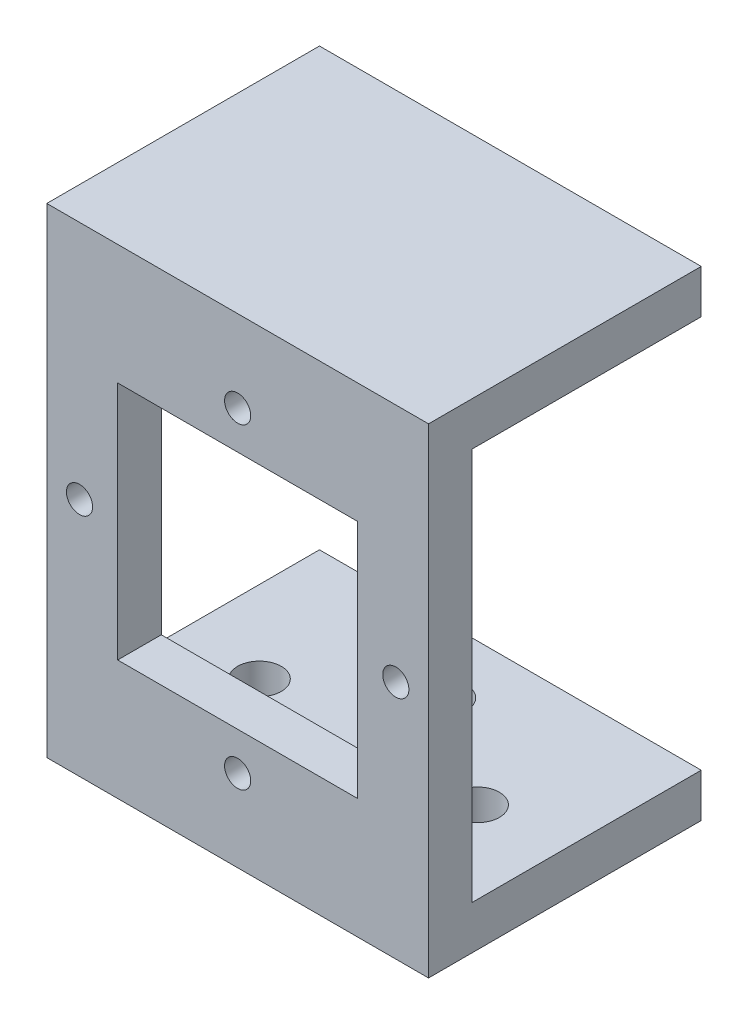
ISO-10303-21;
HEADER;
FILE_DESCRIPTION(('STEP AP214'),'2;1');
FILE_NAME('part.step','',(''),(''),'','','');
FILE_SCHEMA(('AUTOMOTIVE_DESIGN { 1 0 10303 214 1 1 1 1 }'));
ENDSEC;
DATA;
#1=APPLICATION_CONTEXT('core data for automotive mechanical design processes');
#2=APPLICATION_PROTOCOL_DEFINITION('international standard','automotive_design',2000,#1);
#3=PRODUCT_CONTEXT('',#1,'mechanical');
#4=PRODUCT('Part','Part','',(#3));
#5=PRODUCT_RELATED_PRODUCT_CATEGORY('part','',(#4));
#6=PRODUCT_DEFINITION_FORMATION('','',#4);
#7=PRODUCT_DEFINITION_CONTEXT('part definition',#1,'design');
#8=PRODUCT_DEFINITION('design','',#6,#7);
#9=PRODUCT_DEFINITION_SHAPE('','',#8);
#10=(LENGTH_UNIT() NAMED_UNIT(*) SI_UNIT(.MILLI.,.METRE.));
#11=(NAMED_UNIT(*) PLANE_ANGLE_UNIT() SI_UNIT($,.RADIAN.));
#12=(NAMED_UNIT(*) SI_UNIT($,.STERADIAN.) SOLID_ANGLE_UNIT());
#13=UNCERTAINTY_MEASURE_WITH_UNIT(LENGTH_MEASURE(1.E-05),#10,'distance_accuracy_value','');
#14=(GEOMETRIC_REPRESENTATION_CONTEXT(3) GLOBAL_UNCERTAINTY_ASSIGNED_CONTEXT((#13)) GLOBAL_UNIT_ASSIGNED_CONTEXT((#10,
#11,#12)) REPRESENTATION_CONTEXT('',''));
#15=CARTESIAN_POINT('',(0.,0.,0.));
#16=DIRECTION('',(0.,0.,1.));
#17=DIRECTION('',(1.,0.,0.));
#18=AXIS2_PLACEMENT_3D('',#15,#16,#17);
#19=CARTESIAN_POINT('',(0.,0.,4.));
#20=DIRECTION('',(0.,0.,-1.));
#21=DIRECTION('',(-1.,0.,0.));
#22=AXIS2_PLACEMENT_3D('',#19,#20,#21);
#23=PLANE('',#22);
#24=DIRECTION('',(0.,1.,0.));
#25=VECTOR('',#24,1.);
#26=CARTESIAN_POINT('',(17.5,18.,4.));
#27=LINE('',#26,#25);
#28=CARTESIAN_POINT('',(17.5,-22.,4.));
#29=VERTEX_POINT('',#28);
#30=CARTESIAN_POINT('',(17.5,22.,4.));
#31=VERTEX_POINT('',#30);
#32=EDGE_CURVE('E42',#29,#31,#27,.T.);
#33=ORIENTED_EDGE('',*,*,#32,.T.);
#34=DIRECTION('',(1.,0.,0.));
#35=VECTOR('',#34,1.);
#36=CARTESIAN_POINT('',(-17.5,22.,4.));
#37=LINE('',#36,#35);
#38=CARTESIAN_POINT('',(-17.5,22.,4.));
#39=VERTEX_POINT('',#38);
#40=EDGE_CURVE('E135',#39,#31,#37,.T.);
#41=ORIENTED_EDGE('',*,*,#40,.F.);
#42=DIRECTION('',(0.,-1.,0.));
#43=VECTOR('',#42,1.);
#44=CARTESIAN_POINT('',(-17.5,0.,4.));
#45=LINE('',#44,#43);
#46=CARTESIAN_POINT('',(-17.5,-22.,4.));
#47=VERTEX_POINT('',#46);
#48=EDGE_CURVE('E11',#39,#47,#45,.T.);
#49=ORIENTED_EDGE('',*,*,#48,.T.);
#50=DIRECTION('',(-1.,0.,0.));
#51=VECTOR('',#50,1.);
#52=CARTESIAN_POINT('',(17.5,-22.,4.));
#53=LINE('',#52,#51);
#54=EDGE_CURVE('E186',#29,#47,#53,.T.);
#55=ORIENTED_EDGE('',*,*,#54,.F.);
#56=EDGE_LOOP('',(#33,#41,#49,#55));
#57=FACE_BOUND('',#56,.T.);
#58=DIRECTION('',(0.,-1.,0.));
#59=VECTOR('',#58,1.);
#60=CARTESIAN_POINT('',(-11.,-11.,4.));
#61=LINE('',#60,#59);
#62=CARTESIAN_POINT('',(-11.,11.,4.));
#63=VERTEX_POINT('',#62);
#64=CARTESIAN_POINT('',(-11.,-11.,4.));
#65=VERTEX_POINT('',#64);
#66=EDGE_CURVE('E229',#63,#65,#61,.T.);
#67=ORIENTED_EDGE('',*,*,#66,.F.);
#68=DIRECTION('',(-1.,0.,0.));
#69=VECTOR('',#68,1.);
#70=CARTESIAN_POINT('',(11.,11.,4.));
#71=LINE('',#70,#69);
#72=CARTESIAN_POINT('',(11.,11.,4.));
#73=VERTEX_POINT('',#72);
#74=EDGE_CURVE('E236',#73,#63,#71,.T.);
#75=ORIENTED_EDGE('',*,*,#74,.F.);
#76=DIRECTION('',(0.,1.,0.));
#77=VECTOR('',#76,1.);
#78=CARTESIAN_POINT('',(11.,-11.,4.));
#79=LINE('',#78,#77);
#80=CARTESIAN_POINT('',(11.,-11.,4.));
#81=VERTEX_POINT('',#80);
#82=EDGE_CURVE('E234',#81,#73,#79,.T.);
#83=ORIENTED_EDGE('',*,*,#82,.F.);
#84=DIRECTION('',(1.,0.,0.));
#85=VECTOR('',#84,1.);
#86=CARTESIAN_POINT('',(11.,-11.,4.));
#87=LINE('',#86,#85);
#88=EDGE_CURVE('E231',#65,#81,#87,.T.);
#89=ORIENTED_EDGE('',*,*,#88,.F.);
#90=EDGE_LOOP('',(#67,#75,#83,#89));
#91=FACE_BOUND('',#90,.T.);
#92=CARTESIAN_POINT('',(0.,14.5,4.));
#93=DIRECTION('',(0.,0.,1.));
#94=DIRECTION('',(1.,0.,0.));
#95=AXIS2_PLACEMENT_3D('',#92,#93,#94);
#96=CIRCLE('',#95,1.2);
#97=CARTESIAN_POINT('',(1.19999999999999,14.5,4.));
#98=VERTEX_POINT('',#97);
#99=EDGE_CURVE('E224',#98,#98,#96,.T.);
#100=ORIENTED_EDGE('',*,*,#99,.F.);
#101=EDGE_LOOP('',(#100));
#102=FACE_BOUND('',#101,.T.);
#103=CARTESIAN_POINT('',(14.5000000000004,4.07452098546407E-13,4.));
#104=DIRECTION('',(0.,0.,1.));
#105=DIRECTION('',(1.,0.,0.));
#106=AXIS2_PLACEMENT_3D('',#103,#104,#105);
#107=CIRCLE('',#106,1.2);
#108=CARTESIAN_POINT('',(15.7000000000004,4.07452098546407E-13,4.));
#109=VERTEX_POINT('',#108);
#110=EDGE_CURVE('E218',#109,#109,#107,.T.);
#111=ORIENTED_EDGE('',*,*,#110,.F.);
#112=EDGE_LOOP('',(#111));
#113=FACE_BOUND('',#112,.T.);
#114=CARTESIAN_POINT('',(8.12078888257941E-13,-14.5,4.));
#115=DIRECTION('',(0.,0.,1.));
#116=DIRECTION('',(1.,0.,0.));
#117=AXIS2_PLACEMENT_3D('',#114,#115,#116);
#118=CIRCLE('',#117,1.2);
#119=CARTESIAN_POINT('',(1.20000000000081,-14.5,4.));
#120=VERTEX_POINT('',#119);
#121=EDGE_CURVE('E212',#120,#120,#118,.T.);
#122=ORIENTED_EDGE('',*,*,#121,.F.);
#123=EDGE_LOOP('',(#122));
#124=FACE_BOUND('',#123,.T.);
#125=CARTESIAN_POINT('',(-14.4999999999996,-4.0922783640517E-13,4.));
#126=DIRECTION('',(0.,0.,1.));
#127=DIRECTION('',(1.,0.,0.));
#128=AXIS2_PLACEMENT_3D('',#125,#126,#127);
#129=CIRCLE('',#128,1.2);
#130=CARTESIAN_POINT('',(-13.2999999999996,-4.0922783640517E-13,4.));
#131=VERTEX_POINT('',#130);
#132=EDGE_CURVE('E205',#131,#131,#129,.T.);
#133=ORIENTED_EDGE('',*,*,#132,.F.);
#134=EDGE_LOOP('',(#133));
#135=FACE_BOUND('',#134,.T.);
#136=ADVANCED_FACE('F32',(#57,#91,#102,#113,#124,#135),#23,.F.);
#137=CARTESIAN_POINT('',(0.,0.,0.));
#138=DIRECTION('',(0.,0.,-1.));
#139=DIRECTION('',(-1.,0.,0.));
#140=AXIS2_PLACEMENT_3D('',#137,#138,#139);
#141=PLANE('',#140);
#142=CARTESIAN_POINT('',(8.12078888257941E-13,-14.5,0.));
#143=DIRECTION('',(0.,0.,1.));
#144=DIRECTION('',(1.,0.,0.));
#145=AXIS2_PLACEMENT_3D('',#142,#143,#144);
#146=CIRCLE('',#145,1.2);
#147=CARTESIAN_POINT('',(1.20000000000081,-14.5,0.));
#148=VERTEX_POINT('',#147);
#149=EDGE_CURVE('E208',#148,#148,#146,.T.);
#150=ORIENTED_EDGE('',*,*,#149,.T.);
#151=EDGE_LOOP('',(#150));
#152=FACE_BOUND('',#151,.T.);
#153=CARTESIAN_POINT('',(0.,14.5,0.));
#154=DIRECTION('',(0.,0.,1.));
#155=DIRECTION('',(1.,0.,0.));
#156=AXIS2_PLACEMENT_3D('',#153,#154,#155);
#157=CIRCLE('',#156,1.2);
#158=CARTESIAN_POINT('',(1.19999999999999,14.5,0.));
#159=VERTEX_POINT('',#158);
#160=EDGE_CURVE('E221',#159,#159,#157,.T.);
#161=ORIENTED_EDGE('',*,*,#160,.T.);
#162=EDGE_LOOP('',(#161));
#163=FACE_BOUND('',#162,.T.);
#164=DIRECTION('',(-1.,0.,0.));
#165=VECTOR('',#164,1.);
#166=CARTESIAN_POINT('',(-17.5,18.,0.));
#167=LINE('',#166,#165);
#168=CARTESIAN_POINT('',(17.5,18.,0.));
#169=VERTEX_POINT('',#168);
#170=CARTESIAN_POINT('',(-17.5,18.,0.));
#171=VERTEX_POINT('',#170);
#172=EDGE_CURVE('E36',#169,#171,#167,.T.);
#173=ORIENTED_EDGE('',*,*,#172,.F.);
#174=DIRECTION('',(0.,1.,0.));
#175=VECTOR('',#174,1.);
#176=CARTESIAN_POINT('',(17.5,0.,0.));
#177=LINE('',#176,#175);
#178=CARTESIAN_POINT('',(17.5,-18.,0.));
#179=VERTEX_POINT('',#178);
#180=EDGE_CURVE('E254',#179,#169,#177,.T.);
#181=ORIENTED_EDGE('',*,*,#180,.F.);
#182=DIRECTION('',(1.,0.,0.));
#183=VECTOR('',#182,1.);
#184=CARTESIAN_POINT('',(17.5,-18.,0.));
#185=LINE('',#184,#183);
#186=CARTESIAN_POINT('',(-17.5,-18.,0.));
#187=VERTEX_POINT('',#186);
#188=EDGE_CURVE('E261',#187,#179,#185,.T.);
#189=ORIENTED_EDGE('',*,*,#188,.F.);
#190=DIRECTION('',(0.,-1.,0.));
#191=VECTOR('',#190,1.);
#192=CARTESIAN_POINT('',(-17.5,0.,0.));
#193=LINE('',#192,#191);
#194=EDGE_CURVE('E264',#171,#187,#193,.T.);
#195=ORIENTED_EDGE('',*,*,#194,.F.);
#196=EDGE_LOOP('',(#173,#181,#189,#195));
#197=FACE_BOUND('',#196,.T.);
#198=DIRECTION('',(-1.,0.,0.));
#199=VECTOR('',#198,1.);
#200=CARTESIAN_POINT('',(11.,11.,0.));
#201=LINE('',#200,#199);
#202=CARTESIAN_POINT('',(11.,11.,0.));
#203=VERTEX_POINT('',#202);
#204=CARTESIAN_POINT('',(-11.,11.,0.));
#205=VERTEX_POINT('',#204);
#206=EDGE_CURVE('E232',#203,#205,#201,.T.);
#207=ORIENTED_EDGE('',*,*,#206,.T.);
#208=DIRECTION('',(0.,-1.,0.));
#209=VECTOR('',#208,1.);
#210=CARTESIAN_POINT('',(-11.,-11.,0.));
#211=LINE('',#210,#209);
#212=CARTESIAN_POINT('',(-11.,-11.,0.));
#213=VERTEX_POINT('',#212);
#214=EDGE_CURVE('E58',#205,#213,#211,.T.);
#215=ORIENTED_EDGE('',*,*,#214,.T.);
#216=DIRECTION('',(1.,0.,0.));
#217=VECTOR('',#216,1.);
#218=CARTESIAN_POINT('',(11.,-11.,0.));
#219=LINE('',#218,#217);
#220=CARTESIAN_POINT('',(11.,-11.,0.));
#221=VERTEX_POINT('',#220);
#222=EDGE_CURVE('E240',#213,#221,#219,.T.);
#223=ORIENTED_EDGE('',*,*,#222,.T.);
#224=DIRECTION('',(0.,1.,0.));
#225=VECTOR('',#224,1.);
#226=CARTESIAN_POINT('',(11.,-11.,0.));
#227=LINE('',#226,#225);
#228=EDGE_CURVE('E243',#221,#203,#227,.T.);
#229=ORIENTED_EDGE('',*,*,#228,.T.);
#230=EDGE_LOOP('',(#207,#215,#223,#229));
#231=FACE_BOUND('',#230,.T.);
#232=CARTESIAN_POINT('',(14.5000000000004,4.07452098546407E-13,0.));
#233=DIRECTION('',(0.,0.,1.));
#234=DIRECTION('',(1.,0.,0.));
#235=AXIS2_PLACEMENT_3D('',#232,#233,#234);
#236=CIRCLE('',#235,1.2);
#237=CARTESIAN_POINT('',(15.7000000000004,4.07452098546407E-13,0.));
#238=VERTEX_POINT('',#237);
#239=EDGE_CURVE('E215',#238,#238,#236,.T.);
#240=ORIENTED_EDGE('',*,*,#239,.T.);
#241=EDGE_LOOP('',(#240));
#242=FACE_BOUND('',#241,.T.);
#243=CARTESIAN_POINT('',(-14.4999999999996,-4.0922783640517E-13,0.));
#244=DIRECTION('',(0.,0.,1.));
#245=DIRECTION('',(1.,0.,0.));
#246=AXIS2_PLACEMENT_3D('',#243,#244,#245);
#247=CIRCLE('',#246,1.2);
#248=CARTESIAN_POINT('',(-13.2999999999996,-4.0922783640517E-13,0.));
#249=VERTEX_POINT('',#248);
#250=EDGE_CURVE('E209',#249,#249,#247,.T.);
#251=ORIENTED_EDGE('',*,*,#250,.T.);
#252=EDGE_LOOP('',(#251));
#253=FACE_BOUND('',#252,.T.);
#254=ADVANCED_FACE('F284',(#152,#163,#197,#231,#242,#253),#141,.T.);
#255=CARTESIAN_POINT('',(-17.5,0.,4.));
#256=DIRECTION('',(1.,0.,0.));
#257=DIRECTION('',(0.,1.,0.));
#258=AXIS2_PLACEMENT_3D('',#255,#256,#257);
#259=PLANE('',#258);
#260=ORIENTED_EDGE('',*,*,#194,.T.);
#261=DIRECTION('',(0.,0.,-1.));
#262=VECTOR('',#261,1.);
#263=CARTESIAN_POINT('',(-17.5,-18.,4.));
#264=LINE('',#263,#262);
#265=CARTESIAN_POINT('',(-17.5,-18.,-21.));
#266=VERTEX_POINT('',#265);
#267=EDGE_CURVE('E201',#187,#266,#264,.T.);
#268=ORIENTED_EDGE('',*,*,#267,.T.);
#269=DIRECTION('',(0.,1.,0.));
#270=VECTOR('',#269,1.);
#271=CARTESIAN_POINT('',(-17.5,-22.,-21.));
#272=LINE('',#271,#270);
#273=CARTESIAN_POINT('',(-17.5,-22.,-21.));
#274=VERTEX_POINT('',#273);
#275=EDGE_CURVE('E202',#274,#266,#272,.T.);
#276=ORIENTED_EDGE('',*,*,#275,.F.);
#277=DIRECTION('',(0.,0.,-1.));
#278=VECTOR('',#277,1.);
#279=CARTESIAN_POINT('',(-17.5,-22.,4.));
#280=LINE('',#279,#278);
#281=EDGE_CURVE('E130',#47,#274,#280,.T.);
#282=ORIENTED_EDGE('',*,*,#281,.F.);
#283=ORIENTED_EDGE('',*,*,#48,.F.);
#284=DIRECTION('',(0.,0.,1.));
#285=VECTOR('',#284,1.);
#286=CARTESIAN_POINT('',(-17.5,22.,4.));
#287=LINE('',#286,#285);
#288=CARTESIAN_POINT('',(-17.5,22.,-21.));
#289=VERTEX_POINT('',#288);
#290=EDGE_CURVE('E128',#289,#39,#287,.T.);
#291=ORIENTED_EDGE('',*,*,#290,.F.);
#292=DIRECTION('',(0.,-1.,0.));
#293=VECTOR('',#292,1.);
#294=CARTESIAN_POINT('',(-17.5,22.,-21.));
#295=LINE('',#294,#293);
#296=CARTESIAN_POINT('',(-17.5,18.,-21.));
#297=VERTEX_POINT('',#296);
#298=EDGE_CURVE('E152',#289,#297,#295,.T.);
#299=ORIENTED_EDGE('',*,*,#298,.T.);
#300=DIRECTION('',(0.,0.,1.));
#301=VECTOR('',#300,1.);
#302=CARTESIAN_POINT('',(-17.5,18.,4.));
#303=LINE('',#302,#301);
#304=EDGE_CURVE('E157',#297,#171,#303,.T.);
#305=ORIENTED_EDGE('',*,*,#304,.T.);
#306=EDGE_LOOP('',(#260,#268,#276,#282,#283,#291,#299,#305));
#307=FACE_BOUND('',#306,.T.);
#308=ADVANCED_FACE('F34',(#307),#259,.F.);
#309=CARTESIAN_POINT('',(17.5,0.,4.));
#310=DIRECTION('',(-1.,0.,0.));
#311=DIRECTION('',(0.,0.,1.));
#312=AXIS2_PLACEMENT_3D('',#309,#310,#311);
#313=PLANE('',#312);
#314=ORIENTED_EDGE('',*,*,#180,.T.);
#315=DIRECTION('',(0.,0.,-1.));
#316=VECTOR('',#315,1.);
#317=CARTESIAN_POINT('',(17.5,18.,4.));
#318=LINE('',#317,#316);
#319=CARTESIAN_POINT('',(17.5,18.,-21.));
#320=VERTEX_POINT('',#319);
#321=EDGE_CURVE('E147',#169,#320,#318,.T.);
#322=ORIENTED_EDGE('',*,*,#321,.T.);
#323=DIRECTION('',(0.,-1.,0.));
#324=VECTOR('',#323,1.);
#325=CARTESIAN_POINT('',(17.5,22.,-21.));
#326=LINE('',#325,#324);
#327=CARTESIAN_POINT('',(17.5,22.,-21.));
#328=VERTEX_POINT('',#327);
#329=EDGE_CURVE('E161',#328,#320,#326,.T.);
#330=ORIENTED_EDGE('',*,*,#329,.F.);
#331=DIRECTION('',(0.,0.,-1.));
#332=VECTOR('',#331,1.);
#333=CARTESIAN_POINT('',(17.5,22.,4.));
#334=LINE('',#333,#332);
#335=EDGE_CURVE('E139',#31,#328,#334,.T.);
#336=ORIENTED_EDGE('',*,*,#335,.F.);
#337=ORIENTED_EDGE('',*,*,#32,.F.);
#338=DIRECTION('',(0.,0.,1.));
#339=VECTOR('',#338,1.);
#340=CARTESIAN_POINT('',(17.5,-22.,4.));
#341=LINE('',#340,#339);
#342=CARTESIAN_POINT('',(17.5,-22.,-21.));
#343=VERTEX_POINT('',#342);
#344=EDGE_CURVE('E183',#343,#29,#341,.T.);
#345=ORIENTED_EDGE('',*,*,#344,.F.);
#346=DIRECTION('',(0.,1.,0.));
#347=VECTOR('',#346,1.);
#348=CARTESIAN_POINT('',(17.5,-22.,-21.));
#349=LINE('',#348,#347);
#350=CARTESIAN_POINT('',(17.5,-18.,-21.));
#351=VERTEX_POINT('',#350);
#352=EDGE_CURVE('E192',#343,#351,#349,.T.);
#353=ORIENTED_EDGE('',*,*,#352,.T.);
#354=DIRECTION('',(0.,0.,1.));
#355=VECTOR('',#354,1.);
#356=CARTESIAN_POINT('',(17.5,-18.,4.));
#357=LINE('',#356,#355);
#358=EDGE_CURVE('E180',#351,#179,#357,.T.);
#359=ORIENTED_EDGE('',*,*,#358,.T.);
#360=EDGE_LOOP('',(#314,#322,#330,#336,#337,#345,#353,#359));
#361=FACE_BOUND('',#360,.T.);
#362=ADVANCED_FACE('F281',(#361),#313,.F.);
#363=CARTESIAN_POINT('',(-11.,-11.,4.));
#364=DIRECTION('',(1.,0.,0.));
#365=DIRECTION('',(0.,0.,-1.));
#366=AXIS2_PLACEMENT_3D('',#363,#364,#365);
#367=PLANE('',#366);
#368=ORIENTED_EDGE('',*,*,#214,.F.);
#369=DIRECTION('',(0.,0.,-1.));
#370=VECTOR('',#369,1.);
#371=CARTESIAN_POINT('',(-11.,11.,4.));
#372=LINE('',#371,#370);
#373=EDGE_CURVE('E238',#63,#205,#372,.T.);
#374=ORIENTED_EDGE('',*,*,#373,.F.);
#375=ORIENTED_EDGE('',*,*,#66,.T.);
#376=DIRECTION('',(0.,0.,-1.));
#377=VECTOR('',#376,1.);
#378=CARTESIAN_POINT('',(-11.,-11.,4.));
#379=LINE('',#378,#377);
#380=EDGE_CURVE('E252',#65,#213,#379,.T.);
#381=ORIENTED_EDGE('',*,*,#380,.T.);
#382=EDGE_LOOP('',(#368,#374,#375,#381));
#383=FACE_BOUND('',#382,.T.);
#384=ADVANCED_FACE('F332',(#383),#367,.T.);
#385=CARTESIAN_POINT('',(11.,-11.,4.));
#386=DIRECTION('',(0.,1.,0.));
#387=DIRECTION('',(-1.,0.,0.));
#388=AXIS2_PLACEMENT_3D('',#385,#386,#387);
#389=PLANE('',#388);
#390=ORIENTED_EDGE('',*,*,#222,.F.);
#391=ORIENTED_EDGE('',*,*,#380,.F.);
#392=ORIENTED_EDGE('',*,*,#88,.T.);
#393=DIRECTION('',(0.,0.,-1.));
#394=VECTOR('',#393,1.);
#395=CARTESIAN_POINT('',(11.,-11.,4.));
#396=LINE('',#395,#394);
#397=EDGE_CURVE('E250',#81,#221,#396,.T.);
#398=ORIENTED_EDGE('',*,*,#397,.T.);
#399=EDGE_LOOP('',(#390,#391,#392,#398));
#400=FACE_BOUND('',#399,.T.);
#401=ADVANCED_FACE('F339',(#400),#389,.T.);
#402=CARTESIAN_POINT('',(11.,-11.,4.));
#403=DIRECTION('',(-1.,0.,0.));
#404=DIRECTION('',(0.,0.,1.));
#405=AXIS2_PLACEMENT_3D('',#402,#403,#404);
#406=PLANE('',#405);
#407=ORIENTED_EDGE('',*,*,#228,.F.);
#408=ORIENTED_EDGE('',*,*,#397,.F.);
#409=ORIENTED_EDGE('',*,*,#82,.T.);
#410=DIRECTION('',(0.,0.,-1.));
#411=VECTOR('',#410,1.);
#412=CARTESIAN_POINT('',(11.,11.,4.));
#413=LINE('',#412,#411);
#414=EDGE_CURVE('E50',#73,#203,#413,.T.);
#415=ORIENTED_EDGE('',*,*,#414,.T.);
#416=EDGE_LOOP('',(#407,#408,#409,#415));
#417=FACE_BOUND('',#416,.T.);
#418=ADVANCED_FACE('F444',(#417),#406,.T.);
#419=CARTESIAN_POINT('',(11.,11.,4.));
#420=DIRECTION('',(0.,-1.,0.));
#421=DIRECTION('',(0.,0.,-1.));
#422=AXIS2_PLACEMENT_3D('',#419,#420,#421);
#423=PLANE('',#422);
#424=ORIENTED_EDGE('',*,*,#206,.F.);
#425=ORIENTED_EDGE('',*,*,#414,.F.);
#426=ORIENTED_EDGE('',*,*,#74,.T.);
#427=ORIENTED_EDGE('',*,*,#373,.T.);
#428=EDGE_LOOP('',(#424,#425,#426,#427));
#429=FACE_BOUND('',#428,.T.);
#430=ADVANCED_FACE('F434',(#429),#423,.T.);
#431=CARTESIAN_POINT('',(0.,14.5,4.));
#432=DIRECTION('',(0.,0.,-1.));
#433=DIRECTION('',(-1.,0.,0.));
#434=AXIS2_PLACEMENT_3D('',#431,#432,#433);
#435=CYLINDRICAL_SURFACE('',#434,1.2);
#436=ORIENTED_EDGE('',*,*,#99,.T.);
#437=EDGE_LOOP('',(#436));
#438=FACE_BOUND('',#437,.T.);
#439=ORIENTED_EDGE('',*,*,#160,.F.);
#440=EDGE_LOOP('',(#439));
#441=FACE_BOUND('',#440,.T.);
#442=ADVANCED_FACE('F424',(#438,#441),#435,.F.);
#443=CARTESIAN_POINT('',(14.5000000000004,4.07452098546407E-13,4.));
#444=DIRECTION('',(0.,0.,-1.));
#445=DIRECTION('',(-1.,0.,0.));
#446=AXIS2_PLACEMENT_3D('',#443,#444,#445);
#447=CYLINDRICAL_SURFACE('',#446,1.2);
#448=ORIENTED_EDGE('',*,*,#110,.T.);
#449=EDGE_LOOP('',(#448));
#450=FACE_BOUND('',#449,.T.);
#451=ORIENTED_EDGE('',*,*,#239,.F.);
#452=EDGE_LOOP('',(#451));
#453=FACE_BOUND('',#452,.T.);
#454=ADVANCED_FACE('F414',(#450,#453),#447,.F.);
#455=CARTESIAN_POINT('',(8.12078888257941E-13,-14.5,4.));
#456=DIRECTION('',(0.,0.,-1.));
#457=DIRECTION('',(-1.,0.,0.));
#458=AXIS2_PLACEMENT_3D('',#455,#456,#457);
#459=CYLINDRICAL_SURFACE('',#458,1.2);
#460=ORIENTED_EDGE('',*,*,#121,.T.);
#461=EDGE_LOOP('',(#460));
#462=FACE_BOUND('',#461,.T.);
#463=ORIENTED_EDGE('',*,*,#149,.F.);
#464=EDGE_LOOP('',(#463));
#465=FACE_BOUND('',#464,.T.);
#466=ADVANCED_FACE('F404',(#462,#465),#459,.F.);
#467=CARTESIAN_POINT('',(-14.4999999999996,-4.0922783640517E-13,4.));
#468=DIRECTION('',(0.,0.,-1.));
#469=DIRECTION('',(-1.,0.,0.));
#470=AXIS2_PLACEMENT_3D('',#467,#468,#469);
#471=CYLINDRICAL_SURFACE('',#470,1.2);
#472=ORIENTED_EDGE('',*,*,#132,.T.);
#473=EDGE_LOOP('',(#472));
#474=FACE_BOUND('',#473,.T.);
#475=ORIENTED_EDGE('',*,*,#250,.F.);
#476=EDGE_LOOP('',(#475));
#477=FACE_BOUND('',#476,.T.);
#478=ADVANCED_FACE('F301',(#474,#477),#471,.F.);
#479=CARTESIAN_POINT('',(0.,-22.,0.));
#480=DIRECTION('',(0.,1.,0.));
#481=DIRECTION('',(-1.,0.,0.));
#482=AXIS2_PLACEMENT_3D('',#479,#480,#481);
#483=PLANE('',#482);
#484=ORIENTED_EDGE('',*,*,#344,.T.);
#485=ORIENTED_EDGE('',*,*,#54,.T.);
#486=ORIENTED_EDGE('',*,*,#281,.T.);
#487=DIRECTION('',(1.,0.,0.));
#488=VECTOR('',#487,1.);
#489=CARTESIAN_POINT('',(17.5,-22.,-21.));
#490=LINE('',#489,#488);
#491=EDGE_CURVE('E190',#274,#343,#490,.T.);
#492=ORIENTED_EDGE('',*,*,#491,.T.);
#493=EDGE_LOOP('',(#484,#485,#486,#492));
#494=FACE_BOUND('',#493,.T.);
#495=CARTESIAN_POINT('',(10.,-22.,-8.));
#496=DIRECTION('',(0.,-1.,0.));
#497=DIRECTION('',(1.,0.,0.));
#498=AXIS2_PLACEMENT_3D('',#495,#496,#497);
#499=CIRCLE('',#498,2.);
#500=CARTESIAN_POINT('',(12.,-22.,-8.));
#501=VERTEX_POINT('',#500);
#502=EDGE_CURVE('E177',#501,#501,#499,.T.);
#503=ORIENTED_EDGE('',*,*,#502,.F.);
#504=EDGE_LOOP('',(#503));
#505=FACE_BOUND('',#504,.T.);
#506=CARTESIAN_POINT('',(0.,-22.,-15.));
#507=DIRECTION('',(0.,-1.,0.));
#508=DIRECTION('',(1.,0.,0.));
#509=AXIS2_PLACEMENT_3D('',#506,#507,#508);
#510=CIRCLE('',#509,2.);
#511=CARTESIAN_POINT('',(2.00000000000001,-22.,-15.));
#512=VERTEX_POINT('',#511);
#513=EDGE_CURVE('E171',#512,#512,#510,.T.);
#514=ORIENTED_EDGE('',*,*,#513,.F.);
#515=EDGE_LOOP('',(#514));
#516=FACE_BOUND('',#515,.T.);
#517=CARTESIAN_POINT('',(-9.99999999999999,-22.,-8.));
#518=DIRECTION('',(0.,-1.,0.));
#519=DIRECTION('',(-1.,0.,0.));
#520=AXIS2_PLACEMENT_3D('',#517,#518,#519);
#521=CIRCLE('',#520,2.);
#522=CARTESIAN_POINT('',(-12.,-22.,-8.));
#523=VERTEX_POINT('',#522);
#524=EDGE_CURVE('E164',#523,#523,#521,.T.);
#525=ORIENTED_EDGE('',*,*,#524,.F.);
#526=EDGE_LOOP('',(#525));
#527=FACE_BOUND('',#526,.T.);
#528=ADVANCED_FACE('F298',(#494,#505,#516,#527),#483,.F.);
#529=CARTESIAN_POINT('',(0.,-18.,0.));
#530=DIRECTION('',(0.,1.,0.));
#531=DIRECTION('',(-1.,0.,0.));
#532=AXIS2_PLACEMENT_3D('',#529,#530,#531);
#533=PLANE('',#532);
#534=CARTESIAN_POINT('',(0.,-18.,-15.));
#535=DIRECTION('',(0.,-1.,0.));
#536=DIRECTION('',(1.,0.,0.));
#537=AXIS2_PLACEMENT_3D('',#534,#535,#536);
#538=CIRCLE('',#537,2.);
#539=CARTESIAN_POINT('',(2.00000000000001,-18.,-15.));
#540=VERTEX_POINT('',#539);
#541=EDGE_CURVE('E167',#540,#540,#538,.T.);
#542=ORIENTED_EDGE('',*,*,#541,.T.);
#543=EDGE_LOOP('',(#542));
#544=FACE_BOUND('',#543,.T.);
#545=ORIENTED_EDGE('',*,*,#267,.F.);
#546=ORIENTED_EDGE('',*,*,#188,.T.);
#547=ORIENTED_EDGE('',*,*,#358,.F.);
#548=DIRECTION('',(1.,0.,0.));
#549=VECTOR('',#548,1.);
#550=CARTESIAN_POINT('',(17.5,-18.,-21.));
#551=LINE('',#550,#549);
#552=EDGE_CURVE('E187',#266,#351,#551,.T.);
#553=ORIENTED_EDGE('',*,*,#552,.F.);
#554=EDGE_LOOP('',(#545,#546,#547,#553));
#555=FACE_BOUND('',#554,.T.);
#556=CARTESIAN_POINT('',(10.,-18.,-8.));
#557=DIRECTION('',(0.,-1.,0.));
#558=DIRECTION('',(1.,0.,0.));
#559=AXIS2_PLACEMENT_3D('',#556,#557,#558);
#560=CIRCLE('',#559,2.);
#561=CARTESIAN_POINT('',(12.,-18.,-8.));
#562=VERTEX_POINT('',#561);
#563=EDGE_CURVE('E174',#562,#562,#560,.T.);
#564=ORIENTED_EDGE('',*,*,#563,.T.);
#565=EDGE_LOOP('',(#564));
#566=FACE_BOUND('',#565,.T.);
#567=CARTESIAN_POINT('',(-9.99999999999999,-18.,-8.));
#568=DIRECTION('',(0.,-1.,0.));
#569=DIRECTION('',(-1.,0.,0.));
#570=AXIS2_PLACEMENT_3D('',#567,#568,#569);
#571=CIRCLE('',#570,2.);
#572=CARTESIAN_POINT('',(-12.,-18.,-8.));
#573=VERTEX_POINT('',#572);
#574=EDGE_CURVE('E168',#573,#573,#571,.T.);
#575=ORIENTED_EDGE('',*,*,#574,.T.);
#576=EDGE_LOOP('',(#575));
#577=FACE_BOUND('',#576,.T.);
#578=ADVANCED_FACE('F288',(#544,#555,#566,#577),#533,.T.);
#579=CARTESIAN_POINT('',(17.5,-22.,-21.));
#580=DIRECTION('',(0.,0.,1.));
#581=DIRECTION('',(1.,0.,0.));
#582=AXIS2_PLACEMENT_3D('',#579,#580,#581);
#583=PLANE('',#582);
#584=ORIENTED_EDGE('',*,*,#552,.T.);
#585=ORIENTED_EDGE('',*,*,#352,.F.);
#586=ORIENTED_EDGE('',*,*,#491,.F.);
#587=ORIENTED_EDGE('',*,*,#275,.T.);
#588=EDGE_LOOP('',(#584,#585,#586,#587));
#589=FACE_BOUND('',#588,.T.);
#590=ADVANCED_FACE('F294',(#589),#583,.F.);
#591=CARTESIAN_POINT('',(10.,-22.,-8.));
#592=DIRECTION('',(0.,1.,0.));
#593=DIRECTION('',(-1.,0.,0.));
#594=AXIS2_PLACEMENT_3D('',#591,#592,#593);
#595=CYLINDRICAL_SURFACE('',#594,2.);
#596=ORIENTED_EDGE('',*,*,#502,.T.);
#597=EDGE_LOOP('',(#596));
#598=FACE_BOUND('',#597,.T.);
#599=ORIENTED_EDGE('',*,*,#563,.F.);
#600=EDGE_LOOP('',(#599));
#601=FACE_BOUND('',#600,.T.);
#602=ADVANCED_FACE('F322',(#598,#601),#595,.F.);
#603=CARTESIAN_POINT('',(0.,-22.,-15.));
#604=DIRECTION('',(0.,1.,0.));
#605=DIRECTION('',(-1.,0.,0.));
#606=AXIS2_PLACEMENT_3D('',#603,#604,#605);
#607=CYLINDRICAL_SURFACE('',#606,2.);
#608=ORIENTED_EDGE('',*,*,#513,.T.);
#609=EDGE_LOOP('',(#608));
#610=FACE_BOUND('',#609,.T.);
#611=ORIENTED_EDGE('',*,*,#541,.F.);
#612=EDGE_LOOP('',(#611));
#613=FACE_BOUND('',#612,.T.);
#614=ADVANCED_FACE('F312',(#610,#613),#607,.F.);
#615=CARTESIAN_POINT('',(-9.99999999999999,-22.,-8.));
#616=DIRECTION('',(0.,1.,0.));
#617=DIRECTION('',(-1.,0.,0.));
#618=AXIS2_PLACEMENT_3D('',#615,#616,#617);
#619=CYLINDRICAL_SURFACE('',#618,2.);
#620=ORIENTED_EDGE('',*,*,#524,.T.);
#621=EDGE_LOOP('',(#620));
#622=FACE_BOUND('',#621,.T.);
#623=ORIENTED_EDGE('',*,*,#574,.F.);
#624=EDGE_LOOP('',(#623));
#625=FACE_BOUND('',#624,.T.);
#626=ADVANCED_FACE('F309',(#622,#625),#619,.F.);
#627=CARTESIAN_POINT('',(-17.5,22.,-21.));
#628=DIRECTION('',(0.,0.,1.));
#629=DIRECTION('',(1.,0.,0.));
#630=AXIS2_PLACEMENT_3D('',#627,#628,#629);
#631=PLANE('',#630);
#632=DIRECTION('',(-1.,0.,0.));
#633=VECTOR('',#632,1.);
#634=CARTESIAN_POINT('',(-17.5,18.,-21.));
#635=LINE('',#634,#633);
#636=EDGE_CURVE('E145',#320,#297,#635,.T.);
#637=ORIENTED_EDGE('',*,*,#636,.T.);
#638=ORIENTED_EDGE('',*,*,#298,.F.);
#639=DIRECTION('',(-1.,0.,0.));
#640=VECTOR('',#639,1.);
#641=CARTESIAN_POINT('',(-17.5,22.,-21.));
#642=LINE('',#641,#640);
#643=EDGE_CURVE('E143',#328,#289,#642,.T.);
#644=ORIENTED_EDGE('',*,*,#643,.F.);
#645=ORIENTED_EDGE('',*,*,#329,.T.);
#646=EDGE_LOOP('',(#637,#638,#644,#645));
#647=FACE_BOUND('',#646,.T.);
#648=ADVANCED_FACE('F279',(#647),#631,.F.);
#649=CARTESIAN_POINT('',(0.,22.,0.));
#650=DIRECTION('',(0.,-1.,0.));
#651=DIRECTION('',(0.,0.,-1.));
#652=AXIS2_PLACEMENT_3D('',#649,#650,#651);
#653=PLANE('',#652);
#654=ORIENTED_EDGE('',*,*,#290,.T.);
#655=ORIENTED_EDGE('',*,*,#40,.T.);
#656=ORIENTED_EDGE('',*,*,#335,.T.);
#657=ORIENTED_EDGE('',*,*,#643,.T.);
#658=EDGE_LOOP('',(#654,#655,#656,#657));
#659=FACE_BOUND('',#658,.T.);
#660=ADVANCED_FACE('F141',(#659),#653,.F.);
#661=CARTESIAN_POINT('',(0.,18.,0.));
#662=DIRECTION('',(0.,-1.,0.));
#663=DIRECTION('',(0.,0.,-1.));
#664=AXIS2_PLACEMENT_3D('',#661,#662,#663);
#665=PLANE('',#664);
#666=ORIENTED_EDGE('',*,*,#321,.F.);
#667=ORIENTED_EDGE('',*,*,#172,.T.);
#668=ORIENTED_EDGE('',*,*,#304,.F.);
#669=ORIENTED_EDGE('',*,*,#636,.F.);
#670=EDGE_LOOP('',(#666,#667,#668,#669));
#671=FACE_BOUND('',#670,.T.);
#672=ADVANCED_FACE('F273',(#671),#665,.T.);
#673=CLOSED_SHELL('',(#136,#254,#308,#362,#384,#401,#418,#430,#442,#454,#466,#478,#528,#578,
#590,#602,#614,#626,#648,#660,#672));
#674=MANIFOLD_SOLID_BREP('B2',#673);
#675=ADVANCED_BREP_SHAPE_REPRESENTATION('',(#18,#674),#14);
#676=SHAPE_DEFINITION_REPRESENTATION(#9,#675);
ENDSEC;
END-ISO-10303-21;
